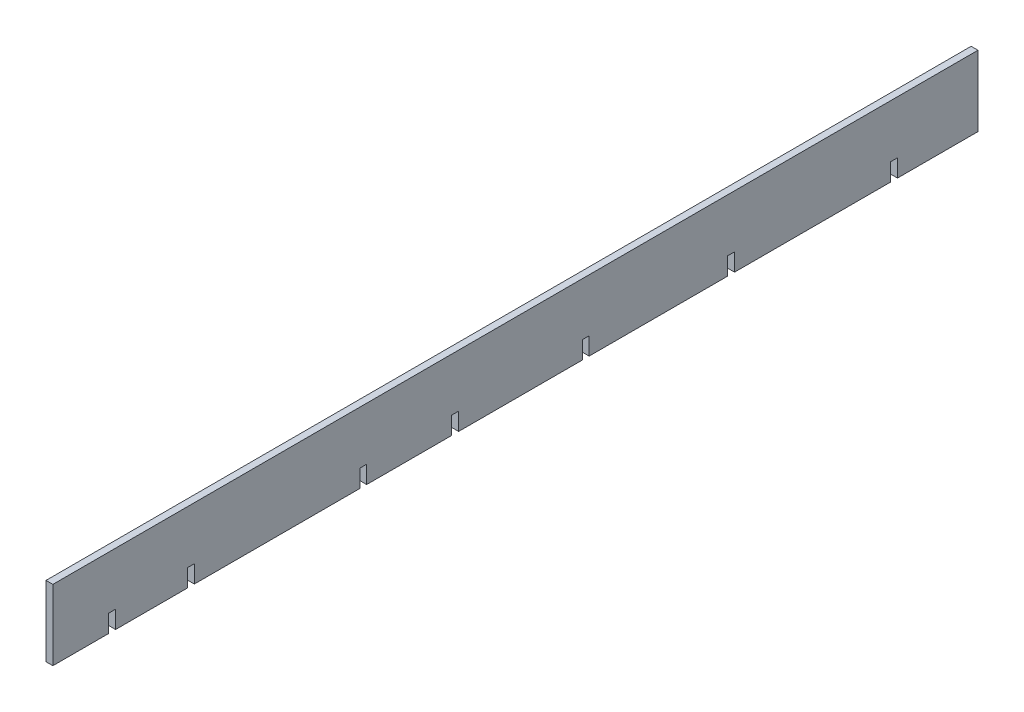
ISO-10303-21;
HEADER;
FILE_DESCRIPTION(('STEP AP214'),'2;1');
FILE_NAME('part.step','',(''),(''),'','','');
FILE_SCHEMA(('AUTOMOTIVE_DESIGN { 1 0 10303 214 1 1 1 1 }'));
ENDSEC;
DATA;
#1=APPLICATION_CONTEXT('core data for automotive mechanical design processes');
#2=APPLICATION_PROTOCOL_DEFINITION('international standard','automotive_design',2000,#1);
#3=PRODUCT_CONTEXT('',#1,'mechanical');
#4=PRODUCT('Part','Part','',(#3));
#5=PRODUCT_RELATED_PRODUCT_CATEGORY('part','',(#4));
#6=PRODUCT_DEFINITION_FORMATION('','',#4);
#7=PRODUCT_DEFINITION_CONTEXT('part definition',#1,'design');
#8=PRODUCT_DEFINITION('design','',#6,#7);
#9=PRODUCT_DEFINITION_SHAPE('','',#8);
#10=(LENGTH_UNIT() NAMED_UNIT(*) SI_UNIT(.MILLI.,.METRE.));
#11=(NAMED_UNIT(*) PLANE_ANGLE_UNIT() SI_UNIT($,.RADIAN.));
#12=(NAMED_UNIT(*) SI_UNIT($,.STERADIAN.) SOLID_ANGLE_UNIT());
#13=UNCERTAINTY_MEASURE_WITH_UNIT(LENGTH_MEASURE(1.E-05),#10,'distance_accuracy_value','');
#14=(GEOMETRIC_REPRESENTATION_CONTEXT(3) GLOBAL_UNCERTAINTY_ASSIGNED_CONTEXT((#13)) GLOBAL_UNIT_ASSIGNED_CONTEXT((#10,
#11,#12)) REPRESENTATION_CONTEXT('',''));
#15=CARTESIAN_POINT('',(0.,0.,0.));
#16=DIRECTION('',(0.,0.,1.));
#17=DIRECTION('',(1.,0.,0.));
#18=AXIS2_PLACEMENT_3D('',#15,#16,#17);
#19=CARTESIAN_POINT('',(154.684804484247,50.7999999999999,541.787102734886));
#20=DIRECTION('',(0.,0.,-1.));
#21=DIRECTION('',(-1.,0.,0.));
#22=AXIS2_PLACEMENT_3D('',#19,#20,#21);
#23=PLANE('',#22);
#24=DIRECTION('',(1.,0.,0.));
#25=VECTOR('',#24,1.);
#26=CARTESIAN_POINT('',(-125.857,50.7999999999999,541.787102734886));
#27=LINE('',#26,#25);
#28=CARTESIAN_POINT('',(-130.81,50.7999999999999,541.787102734886));
#29=VERTEX_POINT('',#28);
#30=CARTESIAN_POINT('',(-125.857,50.7999999999999,541.787102734886));
#31=VERTEX_POINT('',#30);
#32=EDGE_CURVE('E359',#29,#31,#27,.T.);
#33=ORIENTED_EDGE('',*,*,#32,.T.);
#34=DIRECTION('',(0.,-1.,0.));
#35=VECTOR('',#34,1.);
#36=CARTESIAN_POINT('',(-125.857,0.,541.787102734886));
#37=LINE('',#36,#35);
#38=CARTESIAN_POINT('',(-125.857,0.,541.787102734886));
#39=VERTEX_POINT('',#38);
#40=EDGE_CURVE('E362',#31,#39,#37,.T.);
#41=ORIENTED_EDGE('',*,*,#40,.T.);
#42=DIRECTION('',(1.,0.,0.));
#43=VECTOR('',#42,1.);
#44=CARTESIAN_POINT('',(-125.857,0.,541.787102734886));
#45=LINE('',#44,#43);
#46=CARTESIAN_POINT('',(-130.81,0.,541.787102734886));
#47=VERTEX_POINT('',#46);
#48=EDGE_CURVE('E357',#47,#39,#45,.T.);
#49=ORIENTED_EDGE('',*,*,#48,.F.);
#50=DIRECTION('',(0.,-1.,0.));
#51=VECTOR('',#50,1.);
#52=CARTESIAN_POINT('',(-130.81,0.,541.787102734886));
#53=LINE('',#52,#51);
#54=EDGE_CURVE('E354',#29,#47,#53,.T.);
#55=ORIENTED_EDGE('',*,*,#54,.F.);
#56=EDGE_LOOP('',(#33,#41,#49,#55));
#57=FACE_BOUND('',#56,.T.);
#58=ADVANCED_FACE('F33',(#57),#23,.T.);
#59=CARTESIAN_POINT('',(-125.857,-1.78695200307029E-13,1208.65157811766));
#60=DIRECTION('',(0.,0.,1.));
#61=DIRECTION('',(1.,0.,0.));
#62=AXIS2_PLACEMENT_3D('',#59,#60,#61);
#63=PLANE('',#62);
#64=DIRECTION('',(0.,1.,0.));
#65=VECTOR('',#64,1.);
#66=CARTESIAN_POINT('',(-130.81,-1.78695200307029E-13,1208.65157811766));
#67=LINE('',#66,#65);
#68=CARTESIAN_POINT('',(-130.81,-1.78695200307029E-13,1208.65157811766));
#69=VERTEX_POINT('',#68);
#70=CARTESIAN_POINT('',(-130.81,50.7999999999998,1208.65157811766));
#71=VERTEX_POINT('',#70);
#72=EDGE_CURVE('E367',#69,#71,#67,.T.);
#73=ORIENTED_EDGE('',*,*,#72,.F.);
#74=DIRECTION('',(-1.,0.,0.));
#75=VECTOR('',#74,1.);
#76=CARTESIAN_POINT('',(-125.857,-1.78695200307029E-13,1208.65157811766));
#77=LINE('',#76,#75);
#78=CARTESIAN_POINT('',(-125.857,-1.78695200307029E-13,1208.65157811766));
#79=VERTEX_POINT('',#78);
#80=EDGE_CURVE('E577',#79,#69,#77,.T.);
#81=ORIENTED_EDGE('',*,*,#80,.F.);
#82=DIRECTION('',(0.,1.,0.));
#83=VECTOR('',#82,1.);
#84=CARTESIAN_POINT('',(-125.857,-1.78695200307029E-13,1208.65157811766));
#85=LINE('',#84,#83);
#86=CARTESIAN_POINT('',(-125.857,50.7999999999998,1208.65157811766));
#87=VERTEX_POINT('',#86);
#88=EDGE_CURVE('E269',#79,#87,#85,.T.);
#89=ORIENTED_EDGE('',*,*,#88,.T.);
#90=DIRECTION('',(-1.,0.,0.));
#91=VECTOR('',#90,1.);
#92=CARTESIAN_POINT('',(-125.857,50.7999999999998,1208.65157811766));
#93=LINE('',#92,#91);
#94=EDGE_CURVE('E356',#87,#71,#93,.T.);
#95=ORIENTED_EDGE('',*,*,#94,.T.);
#96=EDGE_LOOP('',(#73,#81,#89,#95));
#97=FACE_BOUND('',#96,.T.);
#98=ADVANCED_FACE('F582',(#97),#63,.T.);
#99=CARTESIAN_POINT('',(-125.857,-1.74286534589391E-13,1168.4));
#100=DIRECTION('',(0.,-1.,0.));
#101=DIRECTION('',(0.,0.,-1.));
#102=AXIS2_PLACEMENT_3D('',#99,#100,#101);
#103=PLANE('',#102);
#104=DIRECTION('',(0.,0.,1.));
#105=VECTOR('',#104,1.);
#106=CARTESIAN_POINT('',(-130.81,-1.74286534589391E-13,1168.4));
#107=LINE('',#106,#105);
#108=CARTESIAN_POINT('',(-130.81,-1.74286534589391E-13,1168.4));
#109=VERTEX_POINT('',#108);
#110=EDGE_CURVE('E369',#109,#69,#107,.T.);
#111=ORIENTED_EDGE('',*,*,#110,.F.);
#112=DIRECTION('',(-1.,0.,0.));
#113=VECTOR('',#112,1.);
#114=CARTESIAN_POINT('',(-125.857,-1.74286534589391E-13,1168.4));
#115=LINE('',#114,#113);
#116=CARTESIAN_POINT('',(-125.857,-1.74286534589391E-13,1168.4));
#117=VERTEX_POINT('',#116);
#118=EDGE_CURVE('E571',#117,#109,#115,.T.);
#119=ORIENTED_EDGE('',*,*,#118,.F.);
#120=DIRECTION('',(0.,0.,1.));
#121=VECTOR('',#120,1.);
#122=CARTESIAN_POINT('',(-125.857,-1.74286534589391E-13,1168.4));
#123=LINE('',#122,#121);
#124=EDGE_CURVE('E272',#117,#79,#123,.T.);
#125=ORIENTED_EDGE('',*,*,#124,.T.);
#126=ORIENTED_EDGE('',*,*,#80,.T.);
#127=EDGE_LOOP('',(#111,#119,#125,#126));
#128=FACE_BOUND('',#127,.T.);
#129=ADVANCED_FACE('F579',(#128),#103,.T.);
#130=CARTESIAN_POINT('',(-125.857,12.6999999999999,1168.4));
#131=DIRECTION('',(0.,0.,-1.));
#132=DIRECTION('',(-1.,0.,0.));
#133=AXIS2_PLACEMENT_3D('',#130,#131,#132);
#134=PLANE('',#133);
#135=DIRECTION('',(0.,-1.,0.));
#136=VECTOR('',#135,1.);
#137=CARTESIAN_POINT('',(-130.81,12.6999999999999,1168.4));
#138=LINE('',#137,#136);
#139=CARTESIAN_POINT('',(-130.81,12.6999999999999,1168.4));
#140=VERTEX_POINT('',#139);
#141=EDGE_CURVE('E373',#140,#109,#138,.T.);
#142=ORIENTED_EDGE('',*,*,#141,.F.);
#143=DIRECTION('',(-1.,0.,0.));
#144=VECTOR('',#143,1.);
#145=CARTESIAN_POINT('',(-125.857,12.6999999999999,1168.4));
#146=LINE('',#145,#144);
#147=CARTESIAN_POINT('',(-125.857,12.6999999999999,1168.4));
#148=VERTEX_POINT('',#147);
#149=EDGE_CURVE('E568',#148,#140,#146,.T.);
#150=ORIENTED_EDGE('',*,*,#149,.F.);
#151=DIRECTION('',(0.,-1.,0.));
#152=VECTOR('',#151,1.);
#153=CARTESIAN_POINT('',(-125.857,12.6999999999999,1168.4));
#154=LINE('',#153,#152);
#155=EDGE_CURVE('E276',#148,#117,#154,.T.);
#156=ORIENTED_EDGE('',*,*,#155,.T.);
#157=ORIENTED_EDGE('',*,*,#118,.T.);
#158=EDGE_LOOP('',(#142,#150,#156,#157));
#159=FACE_BOUND('',#158,.T.);
#160=ADVANCED_FACE('F573',(#159),#134,.T.);
#161=CARTESIAN_POINT('',(-125.857,12.6999999999999,1163.447));
#162=DIRECTION('',(0.,-1.,0.));
#163=DIRECTION('',(0.,0.,-1.));
#164=AXIS2_PLACEMENT_3D('',#161,#162,#163);
#165=PLANE('',#164);
#166=DIRECTION('',(0.,0.,1.));
#167=VECTOR('',#166,1.);
#168=CARTESIAN_POINT('',(-130.81,12.6999999999999,1163.447));
#169=LINE('',#168,#167);
#170=CARTESIAN_POINT('',(-130.81,12.6999999999999,1163.447));
#171=VERTEX_POINT('',#170);
#172=EDGE_CURVE('E380',#171,#140,#169,.T.);
#173=ORIENTED_EDGE('',*,*,#172,.F.);
#174=DIRECTION('',(-1.,0.,0.));
#175=VECTOR('',#174,1.);
#176=CARTESIAN_POINT('',(-125.857,12.6999999999999,1163.447));
#177=LINE('',#176,#175);
#178=CARTESIAN_POINT('',(-125.857,12.6999999999999,1163.447));
#179=VERTEX_POINT('',#178);
#180=EDGE_CURVE('E560',#179,#171,#177,.T.);
#181=ORIENTED_EDGE('',*,*,#180,.F.);
#182=DIRECTION('',(0.,0.,1.));
#183=VECTOR('',#182,1.);
#184=CARTESIAN_POINT('',(-125.857,12.6999999999999,1163.447));
#185=LINE('',#184,#183);
#186=EDGE_CURVE('E279',#179,#148,#185,.T.);
#187=ORIENTED_EDGE('',*,*,#186,.T.);
#188=ORIENTED_EDGE('',*,*,#149,.T.);
#189=EDGE_LOOP('',(#173,#181,#187,#188));
#190=FACE_BOUND('',#189,.T.);
#191=ADVANCED_FACE('F566',(#190),#165,.T.);
#192=CARTESIAN_POINT('',(-125.857,-1.72529588175359E-13,1163.447));
#193=DIRECTION('',(0.,0.,1.));
#194=DIRECTION('',(1.,0.,0.));
#195=AXIS2_PLACEMENT_3D('',#192,#193,#194);
#196=PLANE('',#195);
#197=DIRECTION('',(0.,1.,0.));
#198=VECTOR('',#197,1.);
#199=CARTESIAN_POINT('',(-130.81,-1.72529588175359E-13,1163.447));
#200=LINE('',#199,#198);
#201=CARTESIAN_POINT('',(-130.81,-1.72529588175359E-13,1163.447));
#202=VERTEX_POINT('',#201);
#203=EDGE_CURVE('E383',#202,#171,#200,.T.);
#204=ORIENTED_EDGE('',*,*,#203,.F.);
#205=DIRECTION('',(-1.,0.,0.));
#206=VECTOR('',#205,1.);
#207=CARTESIAN_POINT('',(-125.857,-1.72529588175359E-13,1163.447));
#208=LINE('',#207,#206);
#209=CARTESIAN_POINT('',(-125.857,-1.72529588175359E-13,1163.447));
#210=VERTEX_POINT('',#209);
#211=EDGE_CURVE('E554',#210,#202,#208,.T.);
#212=ORIENTED_EDGE('',*,*,#211,.F.);
#213=DIRECTION('',(0.,1.,0.));
#214=VECTOR('',#213,1.);
#215=CARTESIAN_POINT('',(-125.857,-1.72529588175359E-13,1163.447));
#216=LINE('',#215,#214);
#217=EDGE_CURVE('E282',#210,#179,#216,.T.);
#218=ORIENTED_EDGE('',*,*,#217,.T.);
#219=ORIENTED_EDGE('',*,*,#180,.T.);
#220=EDGE_LOOP('',(#204,#212,#218,#219));
#221=FACE_BOUND('',#220,.T.);
#222=ADVANCED_FACE('F562',(#221),#196,.T.);
#223=CARTESIAN_POINT('',(-125.857,-1.19107253308211E-10,1111.631000585));
#224=DIRECTION('',(0.,-1.,2.29532818169652E-12));
#225=DIRECTION('',(0.,-2.29532818169652E-12,-1.));
#226=AXIS2_PLACEMENT_3D('',#223,#224,#225);
#227=PLANE('',#226);
#228=DIRECTION('',(0.,2.29532818169652E-12,1.));
#229=VECTOR('',#228,1.);
#230=CARTESIAN_POINT('',(-130.81,-1.19107253308211E-10,1111.631000585));
#231=LINE('',#230,#229);
#232=CARTESIAN_POINT('',(-130.81,-1.19107253308211E-10,1111.631000585));
#233=VERTEX_POINT('',#232);
#234=EDGE_CURVE('E386',#233,#202,#231,.T.);
#235=ORIENTED_EDGE('',*,*,#234,.F.);
#236=DIRECTION('',(-1.,0.,0.));
#237=VECTOR('',#236,1.);
#238=CARTESIAN_POINT('',(-125.857,-1.19107253308211E-10,1111.631000585));
#239=LINE('',#238,#237);
#240=CARTESIAN_POINT('',(-125.857,-1.19107253308211E-10,1111.631000585));
#241=VERTEX_POINT('',#240);
#242=EDGE_CURVE('E551',#241,#233,#239,.T.);
#243=ORIENTED_EDGE('',*,*,#242,.F.);
#244=DIRECTION('',(0.,2.29532818169652E-12,1.));
#245=VECTOR('',#244,1.);
#246=CARTESIAN_POINT('',(-125.857,-1.19107253308211E-10,1111.631000585));
#247=LINE('',#246,#245);
#248=EDGE_CURVE('E285',#241,#210,#247,.T.);
#249=ORIENTED_EDGE('',*,*,#248,.T.);
#250=ORIENTED_EDGE('',*,*,#211,.T.);
#251=EDGE_LOOP('',(#235,#243,#249,#250));
#252=FACE_BOUND('',#251,.T.);
#253=ADVANCED_FACE('F556',(#252),#227,.T.);
#254=CARTESIAN_POINT('',(-125.857,12.6999999999999,1111.631000585));
#255=DIRECTION('',(0.,0.,-1.));
#256=DIRECTION('',(-1.,0.,0.));
#257=AXIS2_PLACEMENT_3D('',#254,#255,#256);
#258=PLANE('',#257);
#259=DIRECTION('',(0.,-1.,0.));
#260=VECTOR('',#259,1.);
#261=CARTESIAN_POINT('',(-130.81,12.6999999999999,1111.631000585));
#262=LINE('',#261,#260);
#263=CARTESIAN_POINT('',(-130.81,12.6999999999999,1111.631000585));
#264=VERTEX_POINT('',#263);
#265=EDGE_CURVE('E389',#264,#233,#262,.T.);
#266=ORIENTED_EDGE('',*,*,#265,.F.);
#267=DIRECTION('',(-1.,0.,0.));
#268=VECTOR('',#267,1.);
#269=CARTESIAN_POINT('',(-125.857,12.6999999999999,1111.631000585));
#270=LINE('',#269,#268);
#271=CARTESIAN_POINT('',(-125.857,12.6999999999999,1111.631000585));
#272=VERTEX_POINT('',#271);
#273=EDGE_CURVE('E543',#272,#264,#270,.T.);
#274=ORIENTED_EDGE('',*,*,#273,.F.);
#275=DIRECTION('',(0.,-1.,0.));
#276=VECTOR('',#275,1.);
#277=CARTESIAN_POINT('',(-125.857,12.6999999999999,1111.631000585));
#278=LINE('',#277,#276);
#279=EDGE_CURVE('E288',#272,#241,#278,.T.);
#280=ORIENTED_EDGE('',*,*,#279,.T.);
#281=ORIENTED_EDGE('',*,*,#242,.T.);
#282=EDGE_LOOP('',(#266,#274,#280,#281));
#283=FACE_BOUND('',#282,.T.);
#284=ADVANCED_FACE('F549',(#283),#258,.T.);
#285=CARTESIAN_POINT('',(-125.857,12.6999999999999,1106.678));
#286=DIRECTION('',(0.,-1.,0.));
#287=DIRECTION('',(0.,0.,-1.));
#288=AXIS2_PLACEMENT_3D('',#285,#286,#287);
#289=PLANE('',#288);
#290=DIRECTION('',(0.,0.,1.));
#291=VECTOR('',#290,1.);
#292=CARTESIAN_POINT('',(-130.81,12.6999999999999,1106.678));
#293=LINE('',#292,#291);
#294=CARTESIAN_POINT('',(-130.81,12.6999999999999,1106.678));
#295=VERTEX_POINT('',#294);
#296=EDGE_CURVE('E392',#295,#264,#293,.T.);
#297=ORIENTED_EDGE('',*,*,#296,.F.);
#298=DIRECTION('',(-1.,0.,0.));
#299=VECTOR('',#298,1.);
#300=CARTESIAN_POINT('',(-125.857,12.6999999999999,1106.678));
#301=LINE('',#300,#299);
#302=CARTESIAN_POINT('',(-125.857,12.6999999999999,1106.678));
#303=VERTEX_POINT('',#302);
#304=EDGE_CURVE('E537',#303,#295,#301,.T.);
#305=ORIENTED_EDGE('',*,*,#304,.F.);
#306=DIRECTION('',(0.,0.,1.));
#307=VECTOR('',#306,1.);
#308=CARTESIAN_POINT('',(-125.857,12.6999999999999,1106.678));
#309=LINE('',#308,#307);
#310=EDGE_CURVE('E291',#303,#272,#309,.T.);
#311=ORIENTED_EDGE('',*,*,#310,.T.);
#312=ORIENTED_EDGE('',*,*,#273,.T.);
#313=EDGE_LOOP('',(#297,#305,#311,#312));
#314=FACE_BOUND('',#313,.T.);
#315=ADVANCED_FACE('F545',(#314),#289,.T.);
#316=CARTESIAN_POINT('',(-125.857,0.,1106.678));
#317=DIRECTION('',(0.,0.,1.));
#318=DIRECTION('',(1.,0.,0.));
#319=AXIS2_PLACEMENT_3D('',#316,#317,#318);
#320=PLANE('',#319);
#321=DIRECTION('',(0.,1.,0.));
#322=VECTOR('',#321,1.);
#323=CARTESIAN_POINT('',(-130.81,0.,1106.678));
#324=LINE('',#323,#322);
#325=CARTESIAN_POINT('',(-130.81,0.,1106.678));
#326=VERTEX_POINT('',#325);
#327=EDGE_CURVE('E395',#326,#295,#324,.T.);
#328=ORIENTED_EDGE('',*,*,#327,.F.);
#329=DIRECTION('',(-1.,0.,0.));
#330=VECTOR('',#329,1.);
#331=CARTESIAN_POINT('',(-125.857,0.,1106.678));
#332=LINE('',#331,#330);
#333=CARTESIAN_POINT('',(-125.857,0.,1106.678));
#334=VERTEX_POINT('',#333);
#335=EDGE_CURVE('E534',#334,#326,#332,.T.);
#336=ORIENTED_EDGE('',*,*,#335,.F.);
#337=DIRECTION('',(0.,1.,0.));
#338=VECTOR('',#337,1.);
#339=CARTESIAN_POINT('',(-125.857,0.,1106.678));
#340=LINE('',#339,#338);
#341=EDGE_CURVE('E294',#334,#303,#340,.T.);
#342=ORIENTED_EDGE('',*,*,#341,.T.);
#343=ORIENTED_EDGE('',*,*,#304,.T.);
#344=EDGE_LOOP('',(#328,#336,#342,#343));
#345=FACE_BOUND('',#344,.T.);
#346=ADVANCED_FACE('F539',(#345),#320,.T.);
#347=CARTESIAN_POINT('',(-125.857,-1.50000405925716E-13,987.424999999995));
#348=DIRECTION('',(0.,-1.,0.));
#349=DIRECTION('',(0.,0.,-1.));
#350=AXIS2_PLACEMENT_3D('',#347,#348,#349);
#351=PLANE('',#350);
#352=DIRECTION('',(0.,0.,1.));
#353=VECTOR('',#352,1.);
#354=CARTESIAN_POINT('',(-130.81,-1.50000405925716E-13,987.424999999995));
#355=LINE('',#354,#353);
#356=CARTESIAN_POINT('',(-130.81,-1.50000405925716E-13,987.424999999995));
#357=VERTEX_POINT('',#356);
#358=EDGE_CURVE('E398',#357,#326,#355,.T.);
#359=ORIENTED_EDGE('',*,*,#358,.F.);
#360=DIRECTION('',(-1.,0.,0.));
#361=VECTOR('',#360,1.);
#362=CARTESIAN_POINT('',(-125.857,-1.50000405925716E-13,987.424999999995));
#363=LINE('',#362,#361);
#364=CARTESIAN_POINT('',(-125.857,-1.50000405925716E-13,987.424999999995));
#365=VERTEX_POINT('',#364);
#366=EDGE_CURVE('E526',#365,#357,#363,.T.);
#367=ORIENTED_EDGE('',*,*,#366,.F.);
#368=DIRECTION('',(0.,0.,1.));
#369=VECTOR('',#368,1.);
#370=CARTESIAN_POINT('',(-125.857,-1.50000405925716E-13,987.424999999995));
#371=LINE('',#370,#369);
#372=EDGE_CURVE('E297',#365,#334,#371,.T.);
#373=ORIENTED_EDGE('',*,*,#372,.T.);
#374=ORIENTED_EDGE('',*,*,#335,.T.);
#375=EDGE_LOOP('',(#359,#367,#373,#374));
#376=FACE_BOUND('',#375,.T.);
#377=ADVANCED_FACE('F532',(#376),#351,.T.);
#378=CARTESIAN_POINT('',(-125.857,12.6999999999999,987.424999999995));
#379=DIRECTION('',(0.,0.,-1.));
#380=DIRECTION('',(-1.,0.,0.));
#381=AXIS2_PLACEMENT_3D('',#378,#379,#380);
#382=PLANE('',#381);
#383=DIRECTION('',(0.,-1.,0.));
#384=VECTOR('',#383,1.);
#385=CARTESIAN_POINT('',(-130.81,12.6999999999999,987.424999999995));
#386=LINE('',#385,#384);
#387=CARTESIAN_POINT('',(-130.81,12.6999999999999,987.424999999995));
#388=VERTEX_POINT('',#387);
#389=EDGE_CURVE('E401',#388,#357,#386,.T.);
#390=ORIENTED_EDGE('',*,*,#389,.F.);
#391=DIRECTION('',(-1.,0.,0.));
#392=VECTOR('',#391,1.);
#393=CARTESIAN_POINT('',(-125.857,12.6999999999999,987.424999999995));
#394=LINE('',#393,#392);
#395=CARTESIAN_POINT('',(-125.857,12.6999999999999,987.424999999995));
#396=VERTEX_POINT('',#395);
#397=EDGE_CURVE('E520',#396,#388,#394,.T.);
#398=ORIENTED_EDGE('',*,*,#397,.F.);
#399=DIRECTION('',(0.,-1.,0.));
#400=VECTOR('',#399,1.);
#401=CARTESIAN_POINT('',(-125.857,12.6999999999999,987.424999999995));
#402=LINE('',#401,#400);
#403=EDGE_CURVE('E300',#396,#365,#402,.T.);
#404=ORIENTED_EDGE('',*,*,#403,.T.);
#405=ORIENTED_EDGE('',*,*,#366,.T.);
#406=EDGE_LOOP('',(#390,#398,#404,#405));
#407=FACE_BOUND('',#406,.T.);
#408=ADVANCED_FACE('F528',(#407),#382,.T.);
#409=CARTESIAN_POINT('',(-125.857,12.6999999999999,982.471999999995));
#410=DIRECTION('',(0.,-1.,0.));
#411=DIRECTION('',(0.,0.,-1.));
#412=AXIS2_PLACEMENT_3D('',#409,#410,#411);
#413=PLANE('',#412);
#414=DIRECTION('',(0.,0.,1.));
#415=VECTOR('',#414,1.);
#416=CARTESIAN_POINT('',(-130.81,12.6999999999999,982.471999999995));
#417=LINE('',#416,#415);
#418=CARTESIAN_POINT('',(-130.81,12.6999999999999,982.471999999995));
#419=VERTEX_POINT('',#418);
#420=EDGE_CURVE('E404',#419,#388,#417,.T.);
#421=ORIENTED_EDGE('',*,*,#420,.F.);
#422=DIRECTION('',(-1.,0.,0.));
#423=VECTOR('',#422,1.);
#424=CARTESIAN_POINT('',(-125.857,12.6999999999999,982.471999999995));
#425=LINE('',#424,#423);
#426=CARTESIAN_POINT('',(-125.857,12.6999999999999,982.471999999995));
#427=VERTEX_POINT('',#426);
#428=EDGE_CURVE('E517',#427,#419,#425,.T.);
#429=ORIENTED_EDGE('',*,*,#428,.F.);
#430=DIRECTION('',(0.,0.,1.));
#431=VECTOR('',#430,1.);
#432=CARTESIAN_POINT('',(-125.857,12.6999999999999,982.471999999995));
#433=LINE('',#432,#431);
#434=EDGE_CURVE('E303',#427,#396,#433,.T.);
#435=ORIENTED_EDGE('',*,*,#434,.T.);
#436=ORIENTED_EDGE('',*,*,#397,.T.);
#437=EDGE_LOOP('',(#421,#429,#435,#436));
#438=FACE_BOUND('',#437,.T.);
#439=ADVANCED_FACE('F522',(#438),#413,.T.);
#440=CARTESIAN_POINT('',(-125.857,-1.50366542727788E-13,982.471999999995));
#441=DIRECTION('',(0.,0.,1.));
#442=DIRECTION('',(1.,0.,0.));
#443=AXIS2_PLACEMENT_3D('',#440,#441,#442);
#444=PLANE('',#443);
#445=DIRECTION('',(0.,1.,0.));
#446=VECTOR('',#445,1.);
#447=CARTESIAN_POINT('',(-130.81,-1.50366542727788E-13,982.471999999995));
#448=LINE('',#447,#446);
#449=CARTESIAN_POINT('',(-130.81,-1.50366542727788E-13,982.471999999995));
#450=VERTEX_POINT('',#449);
#451=EDGE_CURVE('E407',#450,#419,#448,.T.);
#452=ORIENTED_EDGE('',*,*,#451,.F.);
#453=DIRECTION('',(-1.,0.,0.));
#454=VECTOR('',#453,1.);
#455=CARTESIAN_POINT('',(-125.857,-1.50366542727788E-13,982.471999999995));
#456=LINE('',#455,#454);
#457=CARTESIAN_POINT('',(-125.857,-1.50366542727788E-13,982.471999999995));
#458=VERTEX_POINT('',#457);
#459=EDGE_CURVE('E509',#458,#450,#456,.T.);
#460=ORIENTED_EDGE('',*,*,#459,.F.);
#461=DIRECTION('',(0.,1.,0.));
#462=VECTOR('',#461,1.);
#463=CARTESIAN_POINT('',(-125.857,-1.50366542727788E-13,982.471999999995));
#464=LINE('',#463,#462);
#465=EDGE_CURVE('E306',#458,#427,#464,.T.);
#466=ORIENTED_EDGE('',*,*,#465,.T.);
#467=ORIENTED_EDGE('',*,*,#428,.T.);
#468=EDGE_LOOP('',(#452,#460,#466,#467));
#469=FACE_BOUND('',#468,.T.);
#470=ADVANCED_FACE('F515',(#469),#444,.T.);
#471=CARTESIAN_POINT('',(-125.857,3.5622706118498E-08,921.132259839775));
#472=DIRECTION('',(0.,-1.,-5.80746778385328E-10));
#473=DIRECTION('',(0.,5.80746778385328E-10,-1.));
#474=AXIS2_PLACEMENT_3D('',#471,#472,#473);
#475=PLANE('',#474);
#476=DIRECTION('',(0.,-5.80746778385328E-10,1.));
#477=VECTOR('',#476,1.);
#478=CARTESIAN_POINT('',(-130.81,3.5622706118498E-08,921.132259839775));
#479=LINE('',#478,#477);
#480=CARTESIAN_POINT('',(-130.81,3.5622706118498E-08,921.132259839775));
#481=VERTEX_POINT('',#480);
#482=EDGE_CURVE('E410',#481,#450,#479,.T.);
#483=ORIENTED_EDGE('',*,*,#482,.F.);
#484=DIRECTION('',(-1.,0.,0.));
#485=VECTOR('',#484,1.);
#486=CARTESIAN_POINT('',(-125.857,3.5622706118498E-08,921.132259839775));
#487=LINE('',#486,#485);
#488=CARTESIAN_POINT('',(-125.857,3.5622706118498E-08,921.132259839775));
#489=VERTEX_POINT('',#488);
#490=EDGE_CURVE('E503',#489,#481,#487,.T.);
#491=ORIENTED_EDGE('',*,*,#490,.F.);
#492=DIRECTION('',(0.,-5.80746778385328E-10,1.));
#493=VECTOR('',#492,1.);
#494=CARTESIAN_POINT('',(-125.857,3.5622706118498E-08,921.132259839775));
#495=LINE('',#494,#493);
#496=EDGE_CURVE('E309',#489,#458,#495,.T.);
#497=ORIENTED_EDGE('',*,*,#496,.T.);
#498=ORIENTED_EDGE('',*,*,#459,.T.);
#499=EDGE_LOOP('',(#483,#491,#497,#498));
#500=FACE_BOUND('',#499,.T.);
#501=ADVANCED_FACE('F511',(#500),#475,.T.);
#502=CARTESIAN_POINT('',(-125.857,12.6999999999999,921.132259839775));
#503=DIRECTION('',(0.,0.,-1.));
#504=DIRECTION('',(0.,1.,0.));
#505=AXIS2_PLACEMENT_3D('',#502,#503,#504);
#506=PLANE('',#505);
#507=DIRECTION('',(0.,-1.,0.));
#508=VECTOR('',#507,1.);
#509=CARTESIAN_POINT('',(-130.81,12.6999999999999,921.132259839775));
#510=LINE('',#509,#508);
#511=CARTESIAN_POINT('',(-130.81,12.6999999999999,921.132259839775));
#512=VERTEX_POINT('',#511);
#513=EDGE_CURVE('E413',#512,#481,#510,.T.);
#514=ORIENTED_EDGE('',*,*,#513,.F.);
#515=DIRECTION('',(-1.,0.,0.));
#516=VECTOR('',#515,1.);
#517=CARTESIAN_POINT('',(-125.857,12.6999999999999,921.132259839775));
#518=LINE('',#517,#516);
#519=CARTESIAN_POINT('',(-125.857,12.6999999999999,921.132259839775));
#520=VERTEX_POINT('',#519);
#521=EDGE_CURVE('E500',#520,#512,#518,.T.);
#522=ORIENTED_EDGE('',*,*,#521,.F.);
#523=DIRECTION('',(0.,-1.,0.));
#524=VECTOR('',#523,1.);
#525=CARTESIAN_POINT('',(-125.857,12.6999999999999,921.132259839775));
#526=LINE('',#525,#524);
#527=EDGE_CURVE('E312',#520,#489,#526,.T.);
#528=ORIENTED_EDGE('',*,*,#527,.T.);
#529=ORIENTED_EDGE('',*,*,#490,.T.);
#530=EDGE_LOOP('',(#514,#522,#528,#529));
#531=FACE_BOUND('',#530,.T.);
#532=ADVANCED_FACE('F505',(#531),#506,.T.);
#533=CARTESIAN_POINT('',(-125.857,12.6999999999999,916.179259839522));
#534=DIRECTION('',(0.,-1.,0.));
#535=DIRECTION('',(0.,0.,-1.));
#536=AXIS2_PLACEMENT_3D('',#533,#534,#535);
#537=PLANE('',#536);
#538=DIRECTION('',(0.,0.,1.));
#539=VECTOR('',#538,1.);
#540=CARTESIAN_POINT('',(-130.81,12.6999999999999,916.179259839522));
#541=LINE('',#540,#539);
#542=CARTESIAN_POINT('',(-130.81,12.6999999999999,916.179259839522));
#543=VERTEX_POINT('',#542);
#544=EDGE_CURVE('E416',#543,#512,#541,.T.);
#545=ORIENTED_EDGE('',*,*,#544,.F.);
#546=DIRECTION('',(-1.,0.,0.));
#547=VECTOR('',#546,1.);
#548=CARTESIAN_POINT('',(-125.857,12.6999999999999,916.179259839522));
#549=LINE('',#548,#547);
#550=CARTESIAN_POINT('',(-125.857,12.6999999999999,916.179259839522));
#551=VERTEX_POINT('',#550);
#552=EDGE_CURVE('E492',#551,#543,#549,.T.);
#553=ORIENTED_EDGE('',*,*,#552,.F.);
#554=DIRECTION('',(0.,0.,1.));
#555=VECTOR('',#554,1.);
#556=CARTESIAN_POINT('',(-125.857,12.6999999999999,916.179259839522));
#557=LINE('',#556,#555);
#558=EDGE_CURVE('E315',#551,#520,#557,.T.);
#559=ORIENTED_EDGE('',*,*,#558,.T.);
#560=ORIENTED_EDGE('',*,*,#521,.T.);
#561=EDGE_LOOP('',(#545,#553,#559,#560));
#562=FACE_BOUND('',#561,.T.);
#563=ADVANCED_FACE('F498',(#562),#537,.T.);
#564=CARTESIAN_POINT('',(-125.857,3.56227681890724E-08,916.179259839525));
#565=DIRECTION('',(0.,2.27289753710403E-13,1.));
#566=DIRECTION('',(0.,-1.,2.27289753710403E-13));
#567=AXIS2_PLACEMENT_3D('',#564,#565,#566);
#568=PLANE('',#567);
#569=DIRECTION('',(0.,1.,-2.27289753710403E-13));
#570=VECTOR('',#569,1.);
#571=CARTESIAN_POINT('',(-130.81,3.56227681890724E-08,916.179259839525));
#572=LINE('',#571,#570);
#573=CARTESIAN_POINT('',(-130.81,3.56227681890724E-08,916.179259839525));
#574=VERTEX_POINT('',#573);
#575=EDGE_CURVE('E419',#574,#543,#572,.T.);
#576=ORIENTED_EDGE('',*,*,#575,.F.);
#577=DIRECTION('',(-1.,0.,0.));
#578=VECTOR('',#577,1.);
#579=CARTESIAN_POINT('',(-125.857,3.56227681890724E-08,916.179259839525));
#580=LINE('',#579,#578);
#581=CARTESIAN_POINT('',(-125.857,3.56227681890724E-08,916.179259839525));
#582=VERTEX_POINT('',#581);
#583=EDGE_CURVE('E486',#582,#574,#580,.T.);
#584=ORIENTED_EDGE('',*,*,#583,.F.);
#585=DIRECTION('',(0.,1.,-2.27289753710403E-13));
#586=VECTOR('',#585,1.);
#587=CARTESIAN_POINT('',(-125.857,3.56227681890724E-08,916.179259839525));
#588=LINE('',#587,#586);
#589=EDGE_CURVE('E318',#582,#551,#588,.T.);
#590=ORIENTED_EDGE('',*,*,#589,.T.);
#591=ORIENTED_EDGE('',*,*,#552,.T.);
#592=EDGE_LOOP('',(#576,#584,#590,#591));
#593=FACE_BOUND('',#592,.T.);
#594=ADVANCED_FACE('F494',(#593),#568,.T.);
#595=CARTESIAN_POINT('',(-125.857,-4.25148481968064E-08,827.023888748023));
#596=DIRECTION('',(0.,-1.,8.7642074088486E-10));
#597=DIRECTION('',(0.,-8.7642074088486E-10,-1.));
#598=AXIS2_PLACEMENT_3D('',#595,#596,#597);
#599=PLANE('',#598);
#600=DIRECTION('',(0.,8.7642074088486E-10,1.));
#601=VECTOR('',#600,1.);
#602=CARTESIAN_POINT('',(-130.81,-4.25148481968064E-08,827.023888748023));
#603=LINE('',#602,#601);
#604=CARTESIAN_POINT('',(-130.81,-4.25148481968064E-08,827.023888748023));
#605=VERTEX_POINT('',#604);
#606=EDGE_CURVE('E422',#605,#574,#603,.T.);
#607=ORIENTED_EDGE('',*,*,#606,.F.);
#608=DIRECTION('',(-1.,0.,0.));
#609=VECTOR('',#608,1.);
#610=CARTESIAN_POINT('',(-125.857,-4.25148481968064E-08,827.023888748023));
#611=LINE('',#610,#609);
#612=CARTESIAN_POINT('',(-125.857,-4.25148481968064E-08,827.023888748023));
#613=VERTEX_POINT('',#612);
#614=EDGE_CURVE('E483',#613,#605,#611,.T.);
#615=ORIENTED_EDGE('',*,*,#614,.F.);
#616=DIRECTION('',(0.,8.7642074088486E-10,1.));
#617=VECTOR('',#616,1.);
#618=CARTESIAN_POINT('',(-125.857,-4.25148481968064E-08,827.023888748023));
#619=LINE('',#618,#617);
#620=EDGE_CURVE('E321',#613,#582,#619,.T.);
#621=ORIENTED_EDGE('',*,*,#620,.T.);
#622=ORIENTED_EDGE('',*,*,#583,.T.);
#623=EDGE_LOOP('',(#607,#615,#621,#622));
#624=FACE_BOUND('',#623,.T.);
#625=ADVANCED_FACE('F488',(#624),#599,.T.);
#626=CARTESIAN_POINT('',(-125.857,12.6999999999999,827.023888748023));
#627=DIRECTION('',(0.,0.,-1.));
#628=DIRECTION('',(0.,1.,0.));
#629=AXIS2_PLACEMENT_3D('',#626,#627,#628);
#630=PLANE('',#629);
#631=DIRECTION('',(0.,-1.,0.));
#632=VECTOR('',#631,1.);
#633=CARTESIAN_POINT('',(-130.81,12.6999999999999,827.023888748023));
#634=LINE('',#633,#632);
#635=CARTESIAN_POINT('',(-130.81,12.6999999999999,827.023888748023));
#636=VERTEX_POINT('',#635);
#637=EDGE_CURVE('E425',#636,#605,#634,.T.);
#638=ORIENTED_EDGE('',*,*,#637,.F.);
#639=DIRECTION('',(-1.,0.,0.));
#640=VECTOR('',#639,1.);
#641=CARTESIAN_POINT('',(-125.857,12.6999999999999,827.023888748023));
#642=LINE('',#641,#640);
#643=CARTESIAN_POINT('',(-125.857,12.6999999999999,827.023888748023));
#644=VERTEX_POINT('',#643);
#645=EDGE_CURVE('E475',#644,#636,#642,.T.);
#646=ORIENTED_EDGE('',*,*,#645,.F.);
#647=DIRECTION('',(0.,-1.,0.));
#648=VECTOR('',#647,1.);
#649=CARTESIAN_POINT('',(-125.857,12.6999999999999,827.023888748023));
#650=LINE('',#649,#648);
#651=EDGE_CURVE('E324',#644,#613,#650,.T.);
#652=ORIENTED_EDGE('',*,*,#651,.T.);
#653=ORIENTED_EDGE('',*,*,#614,.T.);
#654=EDGE_LOOP('',(#638,#646,#652,#653));
#655=FACE_BOUND('',#654,.T.);
#656=ADVANCED_FACE('F481',(#655),#630,.T.);
#657=CARTESIAN_POINT('',(-125.857,12.6999999999999,822.070888748275));
#658=DIRECTION('',(0.,-1.,0.));
#659=DIRECTION('',(0.,0.,-1.));
#660=AXIS2_PLACEMENT_3D('',#657,#658,#659);
#661=PLANE('',#660);
#662=DIRECTION('',(0.,0.,1.));
#663=VECTOR('',#662,1.);
#664=CARTESIAN_POINT('',(-130.81,12.6999999999999,822.070888748275));
#665=LINE('',#664,#663);
#666=CARTESIAN_POINT('',(-130.81,12.6999999999999,822.070888748275));
#667=VERTEX_POINT('',#666);
#668=EDGE_CURVE('E428',#667,#636,#665,.T.);
#669=ORIENTED_EDGE('',*,*,#668,.F.);
#670=DIRECTION('',(-1.,0.,0.));
#671=VECTOR('',#670,1.);
#672=CARTESIAN_POINT('',(-125.857,12.6999999999999,822.070888748275));
#673=LINE('',#672,#671);
#674=CARTESIAN_POINT('',(-125.857,12.6999999999999,822.070888748275));
#675=VERTEX_POINT('',#674);
#676=EDGE_CURVE('E469',#675,#667,#673,.T.);
#677=ORIENTED_EDGE('',*,*,#676,.F.);
#678=DIRECTION('',(0.,0.,1.));
#679=VECTOR('',#678,1.);
#680=CARTESIAN_POINT('',(-125.857,12.6999999999999,822.070888748275));
#681=LINE('',#680,#679);
#682=EDGE_CURVE('E327',#675,#644,#681,.T.);
#683=ORIENTED_EDGE('',*,*,#682,.T.);
#684=ORIENTED_EDGE('',*,*,#645,.T.);
#685=EDGE_LOOP('',(#669,#677,#683,#684));
#686=FACE_BOUND('',#685,.T.);
#687=ADVANCED_FACE('F477',(#686),#661,.T.);
#688=CARTESIAN_POINT('',(-125.857,-4.25147776152449E-08,822.070888748275));
#689=DIRECTION('',(0.,0.,1.));
#690=DIRECTION('',(1.,0.,0.));
#691=AXIS2_PLACEMENT_3D('',#688,#689,#690);
#692=PLANE('',#691);
#693=DIRECTION('',(0.,1.,0.));
#694=VECTOR('',#693,1.);
#695=CARTESIAN_POINT('',(-130.81,-4.25147776152449E-08,822.070888748275));
#696=LINE('',#695,#694);
#697=CARTESIAN_POINT('',(-130.81,-4.25147776152449E-08,822.070888748275));
#698=VERTEX_POINT('',#697);
#699=EDGE_CURVE('E431',#698,#667,#696,.T.);
#700=ORIENTED_EDGE('',*,*,#699,.F.);
#701=DIRECTION('',(-1.,0.,0.));
#702=VECTOR('',#701,1.);
#703=CARTESIAN_POINT('',(-125.857,-4.25147776152449E-08,822.070888748275));
#704=LINE('',#703,#702);
#705=CARTESIAN_POINT('',(-125.857,-4.25147776152449E-08,822.070888748275));
#706=VERTEX_POINT('',#705);
#707=EDGE_CURVE('E466',#706,#698,#704,.T.);
#708=ORIENTED_EDGE('',*,*,#707,.F.);
#709=DIRECTION('',(0.,1.,0.));
#710=VECTOR('',#709,1.);
#711=CARTESIAN_POINT('',(-125.857,-4.25147776152449E-08,822.070888748275));
#712=LINE('',#711,#710);
#713=EDGE_CURVE('E330',#706,#675,#712,.T.);
#714=ORIENTED_EDGE('',*,*,#713,.T.);
#715=ORIENTED_EDGE('',*,*,#676,.T.);
#716=EDGE_LOOP('',(#700,#708,#714,#715));
#717=FACE_BOUND('',#716,.T.);
#718=ADVANCED_FACE('F471',(#717),#692,.T.);
#719=CARTESIAN_POINT('',(-125.857,-1.18775383358133E-13,722.248999999996));
#720=DIRECTION('',(0.,-1.,-4.25905173434168E-10));
#721=DIRECTION('',(0.,4.25905173434168E-10,-1.));
#722=AXIS2_PLACEMENT_3D('',#719,#720,#721);
#723=PLANE('',#722);
#724=DIRECTION('',(0.,-4.25905173434168E-10,1.));
#725=VECTOR('',#724,1.);
#726=CARTESIAN_POINT('',(-130.81,-1.18775383358133E-13,722.248999999996));
#727=LINE('',#726,#725);
#728=CARTESIAN_POINT('',(-130.81,-1.18775383358133E-13,722.248999999996));
#729=VERTEX_POINT('',#728);
#730=EDGE_CURVE('E434',#729,#698,#727,.T.);
#731=ORIENTED_EDGE('',*,*,#730,.F.);
#732=DIRECTION('',(-1.,0.,0.));
#733=VECTOR('',#732,1.);
#734=CARTESIAN_POINT('',(-125.857,-1.18775383358133E-13,722.248999999996));
#735=LINE('',#734,#733);
#736=CARTESIAN_POINT('',(-125.857,-1.18775383358133E-13,722.248999999996));
#737=VERTEX_POINT('',#736);
#738=EDGE_CURVE('E458',#737,#729,#735,.T.);
#739=ORIENTED_EDGE('',*,*,#738,.F.);
#740=DIRECTION('',(0.,-4.25905173434168E-10,1.));
#741=VECTOR('',#740,1.);
#742=CARTESIAN_POINT('',(-125.857,-1.18775383358133E-13,722.248999999996));
#743=LINE('',#742,#741);
#744=EDGE_CURVE('E333',#737,#706,#743,.T.);
#745=ORIENTED_EDGE('',*,*,#744,.T.);
#746=ORIENTED_EDGE('',*,*,#707,.T.);
#747=EDGE_LOOP('',(#731,#739,#745,#746));
#748=FACE_BOUND('',#747,.T.);
#749=ADVANCED_FACE('F464',(#748),#723,.T.);
#750=CARTESIAN_POINT('',(-125.857,12.6999999999999,722.248999999996));
#751=DIRECTION('',(0.,0.,-1.));
#752=DIRECTION('',(-1.,0.,0.));
#753=AXIS2_PLACEMENT_3D('',#750,#751,#752);
#754=PLANE('',#753);
#755=DIRECTION('',(0.,-1.,0.));
#756=VECTOR('',#755,1.);
#757=CARTESIAN_POINT('',(-130.81,12.6999999999999,722.248999999996));
#758=LINE('',#757,#756);
#759=CARTESIAN_POINT('',(-130.81,12.6999999999999,722.248999999996));
#760=VERTEX_POINT('',#759);
#761=EDGE_CURVE('E437',#760,#729,#758,.T.);
#762=ORIENTED_EDGE('',*,*,#761,.F.);
#763=DIRECTION('',(-1.,0.,0.));
#764=VECTOR('',#763,1.);
#765=CARTESIAN_POINT('',(-125.857,12.6999999999999,722.248999999996));
#766=LINE('',#765,#764);
#767=CARTESIAN_POINT('',(-125.857,12.6999999999999,722.248999999996));
#768=VERTEX_POINT('',#767);
#769=EDGE_CURVE('E452',#768,#760,#766,.T.);
#770=ORIENTED_EDGE('',*,*,#769,.F.);
#771=DIRECTION('',(0.,-1.,0.));
#772=VECTOR('',#771,1.);
#773=CARTESIAN_POINT('',(-125.857,12.6999999999999,722.248999999996));
#774=LINE('',#773,#772);
#775=EDGE_CURVE('E336',#768,#737,#774,.T.);
#776=ORIENTED_EDGE('',*,*,#775,.T.);
#777=ORIENTED_EDGE('',*,*,#738,.T.);
#778=EDGE_LOOP('',(#762,#770,#776,#777));
#779=FACE_BOUND('',#778,.T.);
#780=ADVANCED_FACE('F460',(#779),#754,.T.);
#781=CARTESIAN_POINT('',(-125.857,12.6999999999999,717.295999999996));
#782=DIRECTION('',(0.,-1.,0.));
#783=DIRECTION('',(0.,0.,-1.));
#784=AXIS2_PLACEMENT_3D('',#781,#782,#783);
#785=PLANE('',#784);
#786=DIRECTION('',(0.,0.,1.));
#787=VECTOR('',#786,1.);
#788=CARTESIAN_POINT('',(-130.81,12.6999999999999,717.295999999996));
#789=LINE('',#788,#787);
#790=CARTESIAN_POINT('',(-130.81,12.6999999999999,717.295999999996));
#791=VERTEX_POINT('',#790);
#792=EDGE_CURVE('E440',#791,#760,#789,.T.);
#793=ORIENTED_EDGE('',*,*,#792,.F.);
#794=DIRECTION('',(-1.,0.,0.));
#795=VECTOR('',#794,1.);
#796=CARTESIAN_POINT('',(-125.857,12.6999999999999,717.295999999996));
#797=LINE('',#796,#795);
#798=CARTESIAN_POINT('',(-125.857,12.6999999999999,717.295999999996));
#799=VERTEX_POINT('',#798);
#800=EDGE_CURVE('E449',#799,#791,#797,.T.);
#801=ORIENTED_EDGE('',*,*,#800,.F.);
#802=DIRECTION('',(0.,0.,1.));
#803=VECTOR('',#802,1.);
#804=CARTESIAN_POINT('',(-125.857,12.6999999999999,717.295999999996));
#805=LINE('',#804,#803);
#806=EDGE_CURVE('E339',#799,#768,#805,.T.);
#807=ORIENTED_EDGE('',*,*,#806,.T.);
#808=ORIENTED_EDGE('',*,*,#769,.T.);
#809=EDGE_LOOP('',(#793,#801,#807,#808));
#810=FACE_BOUND('',#809,.T.);
#811=ADVANCED_FACE('F454',(#810),#785,.T.);
#812=CARTESIAN_POINT('',(-125.857,-1.17891848766719E-13,717.295999999996));
#813=DIRECTION('',(0.,0.,1.));
#814=DIRECTION('',(1.,0.,0.));
#815=AXIS2_PLACEMENT_3D('',#812,#813,#814);
#816=PLANE('',#815);
#817=DIRECTION('',(0.,1.,0.));
#818=VECTOR('',#817,1.);
#819=CARTESIAN_POINT('',(-130.81,-1.17891848766719E-13,717.295999999996));
#820=LINE('',#819,#818);
#821=CARTESIAN_POINT('',(-130.81,-1.17891848766719E-13,717.295999999996));
#822=VERTEX_POINT('',#821);
#823=EDGE_CURVE('E264',#822,#791,#820,.T.);
#824=ORIENTED_EDGE('',*,*,#823,.F.);
#825=DIRECTION('',(-1.,0.,0.));
#826=VECTOR('',#825,1.);
#827=CARTESIAN_POINT('',(-125.857,-1.17891848766719E-13,717.295999999996));
#828=LINE('',#827,#826);
#829=CARTESIAN_POINT('',(-125.857,-1.17891848766719E-13,717.295999999996));
#830=VERTEX_POINT('',#829);
#831=EDGE_CURVE('E447',#830,#822,#828,.T.);
#832=ORIENTED_EDGE('',*,*,#831,.F.);
#833=DIRECTION('',(0.,1.,0.));
#834=VECTOR('',#833,1.);
#835=CARTESIAN_POINT('',(-125.857,-1.17891848766719E-13,717.295999999996));
#836=LINE('',#835,#834);
#837=EDGE_CURVE('E342',#830,#799,#836,.T.);
#838=ORIENTED_EDGE('',*,*,#837,.T.);
#839=ORIENTED_EDGE('',*,*,#800,.T.);
#840=EDGE_LOOP('',(#824,#832,#838,#839));
#841=FACE_BOUND('',#840,.T.);
#842=ADVANCED_FACE('F446',(#841),#816,.T.);
#843=CARTESIAN_POINT('',(-125.857,-1.04897595550319E-13,604.774000000001));
#844=DIRECTION('',(0.,-1.,0.));
#845=DIRECTION('',(0.,0.,-1.));
#846=AXIS2_PLACEMENT_3D('',#843,#844,#845);
#847=PLANE('',#846);
#848=DIRECTION('',(0.,0.,1.));
#849=VECTOR('',#848,1.);
#850=CARTESIAN_POINT('',(-130.81,-1.04897595550319E-13,604.774000000001));
#851=LINE('',#850,#849);
#852=CARTESIAN_POINT('',(-130.81,-1.04897595550319E-13,604.774000000001));
#853=VERTEX_POINT('',#852);
#854=EDGE_CURVE('E262',#853,#822,#851,.T.);
#855=ORIENTED_EDGE('',*,*,#854,.F.);
#856=DIRECTION('',(-1.,0.,0.));
#857=VECTOR('',#856,1.);
#858=CARTESIAN_POINT('',(-125.857,-1.04897595550319E-13,604.774000000001));
#859=LINE('',#858,#857);
#860=CARTESIAN_POINT('',(-125.857,-1.04897595550319E-13,604.774000000001));
#861=VERTEX_POINT('',#860);
#862=EDGE_CURVE('E253',#861,#853,#859,.T.);
#863=ORIENTED_EDGE('',*,*,#862,.F.);
#864=DIRECTION('',(0.,0.,1.));
#865=VECTOR('',#864,1.);
#866=CARTESIAN_POINT('',(-125.857,-1.04897595550319E-13,604.774000000001));
#867=LINE('',#866,#865);
#868=EDGE_CURVE('E345',#861,#830,#867,.T.);
#869=ORIENTED_EDGE('',*,*,#868,.T.);
#870=ORIENTED_EDGE('',*,*,#831,.T.);
#871=EDGE_LOOP('',(#855,#863,#869,#870));
#872=FACE_BOUND('',#871,.T.);
#873=ADVANCED_FACE('F610',(#872),#847,.T.);
#874=CARTESIAN_POINT('',(-125.857,12.6999999999999,604.774000000001));
#875=DIRECTION('',(0.,0.,-1.));
#876=DIRECTION('',(-1.,0.,0.));
#877=AXIS2_PLACEMENT_3D('',#874,#875,#876);
#878=PLANE('',#877);
#879=DIRECTION('',(0.,-1.,0.));
#880=VECTOR('',#879,1.);
#881=CARTESIAN_POINT('',(-130.81,12.6999999999999,604.774000000001));
#882=LINE('',#881,#880);
#883=CARTESIAN_POINT('',(-130.81,12.6999999999999,604.774000000001));
#884=VERTEX_POINT('',#883);
#885=EDGE_CURVE('E257',#884,#853,#882,.T.);
#886=ORIENTED_EDGE('',*,*,#885,.F.);
#887=DIRECTION('',(-1.,0.,0.));
#888=VECTOR('',#887,1.);
#889=CARTESIAN_POINT('',(-125.857,12.6999999999999,604.774000000001));
#890=LINE('',#889,#888);
#891=CARTESIAN_POINT('',(-125.857,12.6999999999999,604.774000000001));
#892=VERTEX_POINT('',#891);
#893=EDGE_CURVE('E245',#892,#884,#890,.T.);
#894=ORIENTED_EDGE('',*,*,#893,.F.);
#895=DIRECTION('',(0.,-1.,0.));
#896=VECTOR('',#895,1.);
#897=CARTESIAN_POINT('',(-125.857,12.6999999999999,604.774000000001));
#898=LINE('',#897,#896);
#899=EDGE_CURVE('E348',#892,#861,#898,.T.);
#900=ORIENTED_EDGE('',*,*,#899,.T.);
#901=ORIENTED_EDGE('',*,*,#862,.T.);
#902=EDGE_LOOP('',(#886,#894,#900,#901));
#903=FACE_BOUND('',#902,.T.);
#904=ADVANCED_FACE('F260',(#903),#878,.T.);
#905=CARTESIAN_POINT('',(-125.857,12.6999999999999,604.774000000001));
#906=DIRECTION('',(0.,1.,0.));
#907=DIRECTION('',(0.,0.,1.));
#908=AXIS2_PLACEMENT_3D('',#905,#906,#907);
#909=PLANE('',#908);
#910=DIRECTION('',(0.,0.,-1.));
#911=VECTOR('',#910,1.);
#912=CARTESIAN_POINT('',(-130.81,12.6999999999999,604.774000000001));
#913=LINE('',#912,#911);
#914=CARTESIAN_POINT('',(-130.81,12.6999999999999,599.821000000001));
#915=VERTEX_POINT('',#914);
#916=EDGE_CURVE('E248',#884,#915,#913,.T.);
#917=ORIENTED_EDGE('',*,*,#916,.T.);
#918=DIRECTION('',(-1.,0.,0.));
#919=VECTOR('',#918,1.);
#920=CARTESIAN_POINT('',(-125.857,12.6999999999999,599.821000000001));
#921=LINE('',#920,#919);
#922=CARTESIAN_POINT('',(-125.857,12.6999999999999,599.821000000001));
#923=VERTEX_POINT('',#922);
#924=EDGE_CURVE('E252',#923,#915,#921,.T.);
#925=ORIENTED_EDGE('',*,*,#924,.F.);
#926=DIRECTION('',(0.,0.,-1.));
#927=VECTOR('',#926,1.);
#928=CARTESIAN_POINT('',(-125.857,12.6999999999999,604.774000000001));
#929=LINE('',#928,#927);
#930=EDGE_CURVE('E145',#892,#923,#929,.T.);
#931=ORIENTED_EDGE('',*,*,#930,.F.);
#932=ORIENTED_EDGE('',*,*,#893,.T.);
#933=EDGE_LOOP('',(#917,#925,#931,#932));
#934=FACE_BOUND('',#933,.T.);
#935=ADVANCED_FACE('F247',(#934),#909,.F.);
#936=CARTESIAN_POINT('',(-125.857,-1.03505310493736E-13,599.821000000001));
#937=DIRECTION('',(0.,0.,1.));
#938=DIRECTION('',(1.,0.,0.));
#939=AXIS2_PLACEMENT_3D('',#936,#937,#938);
#940=PLANE('',#939);
#941=DIRECTION('',(0.,1.,0.));
#942=VECTOR('',#941,1.);
#943=CARTESIAN_POINT('',(-130.81,-1.03505310493736E-13,599.821000000001));
#944=LINE('',#943,#942);
#945=CARTESIAN_POINT('',(-130.81,-1.03505310493736E-13,599.821000000001));
#946=VERTEX_POINT('',#945);
#947=EDGE_CURVE('E42',#946,#915,#944,.T.);
#948=ORIENTED_EDGE('',*,*,#947,.F.);
#949=DIRECTION('',(-1.,0.,0.));
#950=VECTOR('',#949,1.);
#951=CARTESIAN_POINT('',(-125.857,-1.03505310493736E-13,599.821000000001));
#952=LINE('',#951,#950);
#953=CARTESIAN_POINT('',(-125.857,-1.03505310493736E-13,599.821000000001));
#954=VERTEX_POINT('',#953);
#955=EDGE_CURVE('E366',#954,#946,#952,.T.);
#956=ORIENTED_EDGE('',*,*,#955,.F.);
#957=DIRECTION('',(0.,1.,0.));
#958=VECTOR('',#957,1.);
#959=CARTESIAN_POINT('',(-125.857,-1.03505310493736E-13,599.821000000001));
#960=LINE('',#959,#958);
#961=EDGE_CURVE('E351',#954,#923,#960,.T.);
#962=ORIENTED_EDGE('',*,*,#961,.T.);
#963=ORIENTED_EDGE('',*,*,#924,.T.);
#964=EDGE_LOOP('',(#948,#956,#962,#963));
#965=FACE_BOUND('',#964,.T.);
#966=ADVANCED_FACE('F598',(#965),#940,.T.);
#967=CARTESIAN_POINT('',(-125.857,0.,486.156000000003));
#968=DIRECTION('',(0.,-1.,0.));
#969=DIRECTION('',(0.,0.,-1.));
#970=AXIS2_PLACEMENT_3D('',#967,#968,#969);
#971=PLANE('',#970);
#972=DIRECTION('',(0.,0.,1.));
#973=VECTOR('',#972,1.);
#974=CARTESIAN_POINT('',(-130.81,0.,486.156000000003));
#975=LINE('',#974,#973);
#976=EDGE_CURVE('E11',#47,#946,#975,.T.);
#977=ORIENTED_EDGE('',*,*,#976,.F.);
#978=ORIENTED_EDGE('',*,*,#48,.T.);
#979=DIRECTION('',(0.,0.,1.));
#980=VECTOR('',#979,1.);
#981=CARTESIAN_POINT('',(-125.857,0.,486.156000000003));
#982=LINE('',#981,#980);
#983=EDGE_CURVE('E152',#39,#954,#982,.T.);
#984=ORIENTED_EDGE('',*,*,#983,.T.);
#985=ORIENTED_EDGE('',*,*,#955,.T.);
#986=EDGE_LOOP('',(#977,#978,#984,#985));
#987=FACE_BOUND('',#986,.T.);
#988=ADVANCED_FACE('F595',(#987),#971,.T.);
#989=CARTESIAN_POINT('',(-125.857,50.8,-10.548421882342));
#990=DIRECTION('',(0.,-1.,0.));
#991=DIRECTION('',(0.,0.,-1.));
#992=AXIS2_PLACEMENT_3D('',#989,#990,#991);
#993=PLANE('',#992);
#994=ORIENTED_EDGE('',*,*,#32,.F.);
#995=DIRECTION('',(0.,0.,1.));
#996=VECTOR('',#995,1.);
#997=CARTESIAN_POINT('',(-130.81,50.8,-10.548421882342));
#998=LINE('',#997,#996);
#999=EDGE_CURVE('E161',#29,#71,#998,.T.);
#1000=ORIENTED_EDGE('',*,*,#999,.T.);
#1001=ORIENTED_EDGE('',*,*,#94,.F.);
#1002=DIRECTION('',(0.,0.,1.));
#1003=VECTOR('',#1002,1.);
#1004=CARTESIAN_POINT('',(-125.857,50.8,-10.548421882342));
#1005=LINE('',#1004,#1003);
#1006=EDGE_CURVE('E273',#31,#87,#1005,.T.);
#1007=ORIENTED_EDGE('',*,*,#1006,.F.);
#1008=EDGE_LOOP('',(#994,#1000,#1001,#1007));
#1009=FACE_BOUND('',#1008,.T.);
#1010=ADVANCED_FACE('F584',(#1009),#993,.F.);
#1011=CARTESIAN_POINT('',(-130.81,0.,0.));
#1012=DIRECTION('',(-1.,0.,0.));
#1013=DIRECTION('',(0.,0.,1.));
#1014=AXIS2_PLACEMENT_3D('',#1011,#1012,#1013);
#1015=PLANE('',#1014);
#1016=ORIENTED_EDGE('',*,*,#999,.F.);
#1017=ORIENTED_EDGE('',*,*,#54,.T.);
#1018=ORIENTED_EDGE('',*,*,#976,.T.);
#1019=ORIENTED_EDGE('',*,*,#947,.T.);
#1020=ORIENTED_EDGE('',*,*,#916,.F.);
#1021=ORIENTED_EDGE('',*,*,#885,.T.);
#1022=ORIENTED_EDGE('',*,*,#854,.T.);
#1023=ORIENTED_EDGE('',*,*,#823,.T.);
#1024=ORIENTED_EDGE('',*,*,#792,.T.);
#1025=ORIENTED_EDGE('',*,*,#761,.T.);
#1026=ORIENTED_EDGE('',*,*,#730,.T.);
#1027=ORIENTED_EDGE('',*,*,#699,.T.);
#1028=ORIENTED_EDGE('',*,*,#668,.T.);
#1029=ORIENTED_EDGE('',*,*,#637,.T.);
#1030=ORIENTED_EDGE('',*,*,#606,.T.);
#1031=ORIENTED_EDGE('',*,*,#575,.T.);
#1032=ORIENTED_EDGE('',*,*,#544,.T.);
#1033=ORIENTED_EDGE('',*,*,#513,.T.);
#1034=ORIENTED_EDGE('',*,*,#482,.T.);
#1035=ORIENTED_EDGE('',*,*,#451,.T.);
#1036=ORIENTED_EDGE('',*,*,#420,.T.);
#1037=ORIENTED_EDGE('',*,*,#389,.T.);
#1038=ORIENTED_EDGE('',*,*,#358,.T.);
#1039=ORIENTED_EDGE('',*,*,#327,.T.);
#1040=ORIENTED_EDGE('',*,*,#296,.T.);
#1041=ORIENTED_EDGE('',*,*,#265,.T.);
#1042=ORIENTED_EDGE('',*,*,#234,.T.);
#1043=ORIENTED_EDGE('',*,*,#203,.T.);
#1044=ORIENTED_EDGE('',*,*,#172,.T.);
#1045=ORIENTED_EDGE('',*,*,#141,.T.);
#1046=ORIENTED_EDGE('',*,*,#110,.T.);
#1047=ORIENTED_EDGE('',*,*,#72,.T.);
#1048=EDGE_LOOP('',(#1016,#1017,#1018,#1019,#1020,#1021,#1022,#1023,#1024,#1025,#1026,#1027,
#1028,#1029,#1030,#1031,#1032,#1033,#1034,#1035,#1036,#1037,#1038,#1039,#1040,#1041,#1042,#1043,
#1044,#1045,#1046,#1047));
#1049=FACE_BOUND('',#1048,.T.);
#1050=ADVANCED_FACE('F35',(#1049),#1015,.T.);
#1051=CARTESIAN_POINT('',(-125.857,0.,0.));
#1052=DIRECTION('',(-1.,0.,0.));
#1053=DIRECTION('',(0.,0.,1.));
#1054=AXIS2_PLACEMENT_3D('',#1051,#1052,#1053);
#1055=PLANE('',#1054);
#1056=ORIENTED_EDGE('',*,*,#40,.F.);
#1057=ORIENTED_EDGE('',*,*,#1006,.T.);
#1058=ORIENTED_EDGE('',*,*,#88,.F.);
#1059=ORIENTED_EDGE('',*,*,#124,.F.);
#1060=ORIENTED_EDGE('',*,*,#155,.F.);
#1061=ORIENTED_EDGE('',*,*,#186,.F.);
#1062=ORIENTED_EDGE('',*,*,#217,.F.);
#1063=ORIENTED_EDGE('',*,*,#248,.F.);
#1064=ORIENTED_EDGE('',*,*,#279,.F.);
#1065=ORIENTED_EDGE('',*,*,#310,.F.);
#1066=ORIENTED_EDGE('',*,*,#341,.F.);
#1067=ORIENTED_EDGE('',*,*,#372,.F.);
#1068=ORIENTED_EDGE('',*,*,#403,.F.);
#1069=ORIENTED_EDGE('',*,*,#434,.F.);
#1070=ORIENTED_EDGE('',*,*,#465,.F.);
#1071=ORIENTED_EDGE('',*,*,#496,.F.);
#1072=ORIENTED_EDGE('',*,*,#527,.F.);
#1073=ORIENTED_EDGE('',*,*,#558,.F.);
#1074=ORIENTED_EDGE('',*,*,#589,.F.);
#1075=ORIENTED_EDGE('',*,*,#620,.F.);
#1076=ORIENTED_EDGE('',*,*,#651,.F.);
#1077=ORIENTED_EDGE('',*,*,#682,.F.);
#1078=ORIENTED_EDGE('',*,*,#713,.F.);
#1079=ORIENTED_EDGE('',*,*,#744,.F.);
#1080=ORIENTED_EDGE('',*,*,#775,.F.);
#1081=ORIENTED_EDGE('',*,*,#806,.F.);
#1082=ORIENTED_EDGE('',*,*,#837,.F.);
#1083=ORIENTED_EDGE('',*,*,#868,.F.);
#1084=ORIENTED_EDGE('',*,*,#899,.F.);
#1085=ORIENTED_EDGE('',*,*,#930,.T.);
#1086=ORIENTED_EDGE('',*,*,#961,.F.);
#1087=ORIENTED_EDGE('',*,*,#983,.F.);
#1088=EDGE_LOOP('',(#1056,#1057,#1058,#1059,#1060,#1061,#1062,#1063,#1064,#1065,#1066,#1067,
#1068,#1069,#1070,#1071,#1072,#1073,#1074,#1075,#1076,#1077,#1078,#1079,#1080,#1081,#1082,#1083,
#1084,#1085,#1086,#1087));
#1089=FACE_BOUND('',#1088,.T.);
#1090=ADVANCED_FACE('F593',(#1089),#1055,.F.);
#1091=CLOSED_SHELL('',(#58,#98,#129,#160,#191,#222,#253,#284,#315,#346,#377,#408,#439,#470,#501,
#532,#563,#594,#625,#656,#687,#718,#749,#780,#811,#842,#873,#904,#935,#966,#988,#1010,#1050,#1090));
#1092=MANIFOLD_SOLID_BREP('B2',#1091);
#1093=ADVANCED_BREP_SHAPE_REPRESENTATION('',(#18,#1092),#14);
#1094=SHAPE_DEFINITION_REPRESENTATION(#9,#1093);
ENDSEC;
END-ISO-10303-21;
